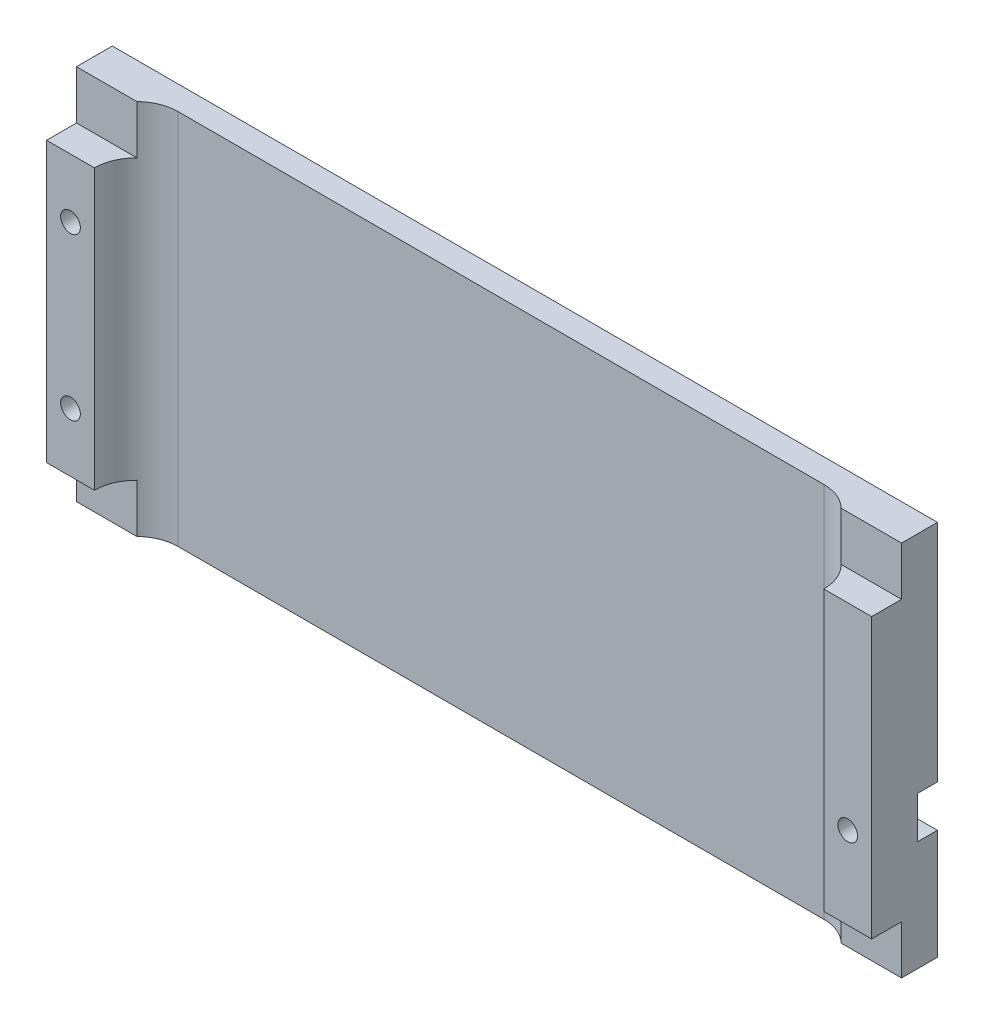
ISO-10303-21;
HEADER;
FILE_DESCRIPTION(('STEP AP214'),'2;1');
FILE_NAME('part.step','',(''),(''),'','','');
FILE_SCHEMA(('AUTOMOTIVE_DESIGN { 1 0 10303 214 1 1 1 1 }'));
ENDSEC;
DATA;
#1=APPLICATION_CONTEXT('core data for automotive mechanical design processes');
#2=APPLICATION_PROTOCOL_DEFINITION('international standard','automotive_design',2000,#1);
#3=PRODUCT_CONTEXT('',#1,'mechanical');
#4=PRODUCT('Part','Part','',(#3));
#5=PRODUCT_RELATED_PRODUCT_CATEGORY('part','',(#4));
#6=PRODUCT_DEFINITION_FORMATION('','',#4);
#7=PRODUCT_DEFINITION_CONTEXT('part definition',#1,'design');
#8=PRODUCT_DEFINITION('design','',#6,#7);
#9=PRODUCT_DEFINITION_SHAPE('','',#8);
#10=(LENGTH_UNIT() NAMED_UNIT(*) SI_UNIT(.MILLI.,.METRE.));
#11=(NAMED_UNIT(*) PLANE_ANGLE_UNIT() SI_UNIT($,.RADIAN.));
#12=(NAMED_UNIT(*) SI_UNIT($,.STERADIAN.) SOLID_ANGLE_UNIT());
#13=UNCERTAINTY_MEASURE_WITH_UNIT(LENGTH_MEASURE(1.E-05),#10,'distance_accuracy_value','');
#14=(GEOMETRIC_REPRESENTATION_CONTEXT(3) GLOBAL_UNCERTAINTY_ASSIGNED_CONTEXT((#13)) GLOBAL_UNIT_ASSIGNED_CONTEXT((#10,
#11,#12)) REPRESENTATION_CONTEXT('',''));
#15=CARTESIAN_POINT('',(0.,0.,0.));
#16=DIRECTION('',(0.,0.,1.));
#17=DIRECTION('',(1.,0.,0.));
#18=AXIS2_PLACEMENT_3D('',#15,#16,#17);
#19=CARTESIAN_POINT('',(-65.,13.5,11.));
#20=DIRECTION('',(0.,0.,-1.));
#21=DIRECTION('',(-1.,0.,0.));
#22=AXIS2_PLACEMENT_3D('',#19,#20,#21);
#23=CYLINDRICAL_SURFACE('',#22,1.65);
#24=CARTESIAN_POINT('',(-65.,13.5,11.));
#25=DIRECTION('',(0.,0.,-1.));
#26=DIRECTION('',(-1.,0.,0.));
#27=AXIS2_PLACEMENT_3D('',#24,#25,#26);
#28=CIRCLE('',#27,1.65);
#29=CARTESIAN_POINT('',(-66.65,13.5,11.));
#30=VERTEX_POINT('',#29);
#31=EDGE_CURVE('E317',#30,#30,#28,.T.);
#32=ORIENTED_EDGE('',*,*,#31,.F.);
#33=EDGE_LOOP('',(#32));
#34=FACE_BOUND('',#33,.T.);
#35=CARTESIAN_POINT('',(-65.,13.5,3.3));
#36=DIRECTION('',(0.,0.,-1.));
#37=DIRECTION('',(-1.,0.,0.));
#38=AXIS2_PLACEMENT_3D('',#35,#36,#37);
#39=CIRCLE('',#38,1.65);
#40=CARTESIAN_POINT('',(-66.65,13.5,3.3));
#41=VERTEX_POINT('',#40);
#42=EDGE_CURVE('E310',#41,#41,#39,.F.);
#43=ORIENTED_EDGE('',*,*,#42,.F.);
#44=EDGE_LOOP('',(#43));
#45=FACE_BOUND('',#44,.T.);
#46=ADVANCED_FACE('F32',(#34,#45),#23,.F.);
#47=CARTESIAN_POINT('',(-65.,-13.5,11.));
#48=DIRECTION('',(0.,0.,-1.));
#49=DIRECTION('',(-1.,0.,0.));
#50=AXIS2_PLACEMENT_3D('',#47,#48,#49);
#51=CYLINDRICAL_SURFACE('',#50,1.65);
#52=CARTESIAN_POINT('',(-65.,-13.5,11.));
#53=DIRECTION('',(0.,0.,-1.));
#54=DIRECTION('',(-1.,0.,0.));
#55=AXIS2_PLACEMENT_3D('',#52,#53,#54);
#56=CIRCLE('',#55,1.65);
#57=CARTESIAN_POINT('',(-66.65,-13.5,11.));
#58=VERTEX_POINT('',#57);
#59=EDGE_CURVE('E314',#58,#58,#56,.T.);
#60=ORIENTED_EDGE('',*,*,#59,.F.);
#61=EDGE_LOOP('',(#60));
#62=FACE_BOUND('',#61,.T.);
#63=CARTESIAN_POINT('',(-65.,-13.5,3.3));
#64=DIRECTION('',(0.,0.,-1.));
#65=DIRECTION('',(-1.,0.,0.));
#66=AXIS2_PLACEMENT_3D('',#63,#64,#65);
#67=CIRCLE('',#66,1.65);
#68=CARTESIAN_POINT('',(-66.65,-13.5,3.3));
#69=VERTEX_POINT('',#68);
#70=EDGE_CURVE('E412',#69,#69,#67,.F.);
#71=ORIENTED_EDGE('',*,*,#70,.F.);
#72=EDGE_LOOP('',(#71));
#73=FACE_BOUND('',#72,.T.);
#74=ADVANCED_FACE('F514',(#62,#73),#51,.F.);
#75=CARTESIAN_POINT('',(65.,-9.60000000000002,11.));
#76=DIRECTION('',(0.,0.,-1.));
#77=DIRECTION('',(-1.,0.,0.));
#78=AXIS2_PLACEMENT_3D('',#75,#76,#77);
#79=CYLINDRICAL_SURFACE('',#78,1.65);
#80=CARTESIAN_POINT('',(65.,-9.60000000000002,11.));
#81=DIRECTION('',(0.,0.,-1.));
#82=DIRECTION('',(-1.,0.,0.));
#83=AXIS2_PLACEMENT_3D('',#80,#81,#82);
#84=CIRCLE('',#83,1.65);
#85=CARTESIAN_POINT('',(63.35,-9.60000000000002,11.));
#86=VERTEX_POINT('',#85);
#87=EDGE_CURVE('E313',#86,#86,#84,.T.);
#88=ORIENTED_EDGE('',*,*,#87,.F.);
#89=EDGE_LOOP('',(#88));
#90=FACE_BOUND('',#89,.T.);
#91=CARTESIAN_POINT('',(65.,-9.60000000000002,3.3));
#92=DIRECTION('',(0.,0.,-1.));
#93=DIRECTION('',(-1.,0.,0.));
#94=AXIS2_PLACEMENT_3D('',#91,#92,#93);
#95=CIRCLE('',#94,1.65);
#96=CARTESIAN_POINT('',(63.35,-9.60000000000002,3.3));
#97=VERTEX_POINT('',#96);
#98=EDGE_CURVE('E299',#97,#97,#95,.F.);
#99=ORIENTED_EDGE('',*,*,#98,.F.);
#100=EDGE_LOOP('',(#99));
#101=FACE_BOUND('',#100,.T.);
#102=ADVANCED_FACE('F520',(#90,#101),#79,.F.);
#103=CARTESIAN_POINT('',(0.,0.,6.));
#104=DIRECTION('',(0.,0.,1.));
#105=DIRECTION('',(1.,0.,0.));
#106=AXIS2_PLACEMENT_3D('',#103,#104,#105);
#107=PLANE('',#106);
#108=DIRECTION('',(1.,0.,0.));
#109=VECTOR('',#108,1.);
#110=CARTESIAN_POINT('',(-69.,-31.5,6.));
#111=LINE('',#110,#109);
#112=CARTESIAN_POINT('',(-69.,-31.5,6.));
#113=VERTEX_POINT('',#112);
#114=CARTESIAN_POINT('',(-58.8989794855664,-31.5,6.));
#115=VERTEX_POINT('',#114);
#116=EDGE_CURVE('E53',#113,#115,#111,.T.);
#117=ORIENTED_EDGE('',*,*,#116,.T.);
#118=DIRECTION('',(0.,1.,0.));
#119=VECTOR('',#118,1.);
#120=CARTESIAN_POINT('',(-58.8989794855664,-31.5,6.));
#121=LINE('',#120,#119);
#122=CARTESIAN_POINT('',(-58.8989794855664,-23.35,6.));
#123=VERTEX_POINT('',#122);
#124=EDGE_CURVE('E40',#115,#123,#121,.T.);
#125=ORIENTED_EDGE('',*,*,#124,.T.);
#126=DIRECTION('',(1.,0.,0.));
#127=VECTOR('',#126,1.);
#128=CARTESIAN_POINT('',(-69.,-23.35,6.));
#129=LINE('',#128,#127);
#130=CARTESIAN_POINT('',(-69.,-23.35,6.));
#131=VERTEX_POINT('',#130);
#132=EDGE_CURVE('E46',#131,#123,#129,.T.);
#133=ORIENTED_EDGE('',*,*,#132,.F.);
#134=DIRECTION('',(0.,-1.,0.));
#135=VECTOR('',#134,1.);
#136=CARTESIAN_POINT('',(-69.,31.5,6.));
#137=LINE('',#136,#135);
#138=EDGE_CURVE('E362',#131,#113,#137,.T.);
#139=ORIENTED_EDGE('',*,*,#138,.T.);
#140=EDGE_LOOP('',(#117,#125,#133,#139));
#141=FACE_BOUND('',#140,.T.);
#142=ADVANCED_FACE('F447',(#141),#107,.T.);
#143=CARTESIAN_POINT('',(-69.,31.5,6.));
#144=VERTEX_POINT('',#143);
#145=CARTESIAN_POINT('',(-69.,23.35,6.));
#146=VERTEX_POINT('',#145);
#147=EDGE_CURVE('E363',#144,#146,#137,.T.);
#148=ORIENTED_EDGE('',*,*,#147,.T.);
#149=DIRECTION('',(-1.,0.,0.));
#150=VECTOR('',#149,1.);
#151=CARTESIAN_POINT('',(-69.,23.35,6.));
#152=LINE('',#151,#150);
#153=CARTESIAN_POINT('',(-58.8989794855664,23.35,6.));
#154=VERTEX_POINT('',#153);
#155=EDGE_CURVE('E326',#154,#146,#152,.T.);
#156=ORIENTED_EDGE('',*,*,#155,.F.);
#157=DIRECTION('',(0.,1.,0.));
#158=VECTOR('',#157,1.);
#159=CARTESIAN_POINT('',(-58.8989794855664,23.35,6.));
#160=LINE('',#159,#158);
#161=CARTESIAN_POINT('',(-58.8989794855664,31.5,6.));
#162=VERTEX_POINT('',#161);
#163=EDGE_CURVE('E439',#154,#162,#160,.T.);
#164=ORIENTED_EDGE('',*,*,#163,.T.);
#165=DIRECTION('',(-1.,0.,0.));
#166=VECTOR('',#165,1.);
#167=CARTESIAN_POINT('',(-69.,31.5,6.));
#168=LINE('',#167,#166);
#169=EDGE_CURVE('E367',#162,#144,#168,.T.);
#170=ORIENTED_EDGE('',*,*,#169,.T.);
#171=EDGE_LOOP('',(#148,#156,#164,#170));
#172=FACE_BOUND('',#171,.T.);
#173=ADVANCED_FACE('F499',(#172),#107,.T.);
#174=CARTESIAN_POINT('',(0.,0.,6.));
#175=DIRECTION('',(0.,0.,-1.));
#176=DIRECTION('',(-1.,0.,0.));
#177=AXIS2_PLACEMENT_3D('',#174,#175,#176);
#178=PLANE('',#177);
#179=DIRECTION('',(1.,0.,0.));
#180=VECTOR('',#179,1.);
#181=CARTESIAN_POINT('',(61.,-23.35,6.));
#182=LINE('',#181,#180);
#183=CARTESIAN_POINT('',(58.8989794855664,-23.35,6.));
#184=VERTEX_POINT('',#183);
#185=CARTESIAN_POINT('',(69.,-23.35,6.));
#186=VERTEX_POINT('',#185);
#187=EDGE_CURVE('E341',#184,#186,#182,.T.);
#188=ORIENTED_EDGE('',*,*,#187,.F.);
#189=DIRECTION('',(0.,-1.,0.));
#190=VECTOR('',#189,1.);
#191=CARTESIAN_POINT('',(58.8989794855664,-23.35,6.));
#192=LINE('',#191,#190);
#193=CARTESIAN_POINT('',(58.8989794855664,-31.5,6.));
#194=VERTEX_POINT('',#193);
#195=EDGE_CURVE('E423',#184,#194,#192,.T.);
#196=ORIENTED_EDGE('',*,*,#195,.T.);
#197=DIRECTION('',(1.,0.,0.));
#198=VECTOR('',#197,1.);
#199=CARTESIAN_POINT('',(69.,-31.5,6.));
#200=LINE('',#199,#198);
#201=CARTESIAN_POINT('',(69.,-31.5,6.));
#202=VERTEX_POINT('',#201);
#203=EDGE_CURVE('E375',#194,#202,#200,.T.);
#204=ORIENTED_EDGE('',*,*,#203,.T.);
#205=DIRECTION('',(0.,1.,0.));
#206=VECTOR('',#205,1.);
#207=CARTESIAN_POINT('',(69.,31.5,6.));
#208=LINE('',#207,#206);
#209=EDGE_CURVE('E371',#202,#186,#208,.T.);
#210=ORIENTED_EDGE('',*,*,#209,.T.);
#211=EDGE_LOOP('',(#188,#196,#204,#210));
#212=FACE_BOUND('',#211,.T.);
#213=ADVANCED_FACE('F775',(#212),#178,.F.);
#214=DIRECTION('',(-1.,0.,0.));
#215=VECTOR('',#214,1.);
#216=CARTESIAN_POINT('',(61.,23.35,6.));
#217=LINE('',#216,#215);
#218=CARTESIAN_POINT('',(69.,23.35,6.));
#219=VERTEX_POINT('',#218);
#220=CARTESIAN_POINT('',(58.8989794855664,23.35,6.));
#221=VERTEX_POINT('',#220);
#222=EDGE_CURVE('E346',#219,#221,#217,.T.);
#223=ORIENTED_EDGE('',*,*,#222,.F.);
#224=CARTESIAN_POINT('',(69.,31.5,6.));
#225=VERTEX_POINT('',#224);
#226=EDGE_CURVE('E370',#219,#225,#208,.T.);
#227=ORIENTED_EDGE('',*,*,#226,.T.);
#228=DIRECTION('',(-1.,0.,0.));
#229=VECTOR('',#228,1.);
#230=CARTESIAN_POINT('',(69.,31.5,6.));
#231=LINE('',#230,#229);
#232=CARTESIAN_POINT('',(58.8989794855664,31.5,6.));
#233=VERTEX_POINT('',#232);
#234=EDGE_CURVE('E373',#225,#233,#231,.T.);
#235=ORIENTED_EDGE('',*,*,#234,.T.);
#236=DIRECTION('',(0.,-1.,0.));
#237=VECTOR('',#236,1.);
#238=CARTESIAN_POINT('',(58.8989794855664,31.5,6.));
#239=LINE('',#238,#237);
#240=EDGE_CURVE('E431',#233,#221,#239,.T.);
#241=ORIENTED_EDGE('',*,*,#240,.T.);
#242=EDGE_LOOP('',(#223,#227,#235,#241));
#243=FACE_BOUND('',#242,.T.);
#244=ADVANCED_FACE('F485',(#243),#178,.F.);
#245=CARTESIAN_POINT('',(0.,0.,4.));
#246=DIRECTION('',(0.,0.,1.));
#247=DIRECTION('',(1.,0.,0.));
#248=AXIS2_PLACEMENT_3D('',#245,#246,#247);
#249=PLANE('',#248);
#250=DIRECTION('',(1.,0.,0.));
#251=VECTOR('',#250,1.);
#252=CARTESIAN_POINT('',(69.,-31.5,4.));
#253=LINE('',#252,#251);
#254=CARTESIAN_POINT('',(-54.,-31.5,4.));
#255=VERTEX_POINT('',#254);
#256=CARTESIAN_POINT('',(54.,-31.5,4.));
#257=VERTEX_POINT('',#256);
#258=EDGE_CURVE('E379',#255,#257,#253,.T.);
#259=ORIENTED_EDGE('',*,*,#258,.T.);
#260=DIRECTION('',(0.,-1.,0.));
#261=VECTOR('',#260,1.);
#262=CARTESIAN_POINT('',(54.,0.,4.));
#263=LINE('',#262,#261);
#264=CARTESIAN_POINT('',(54.,31.5,4.));
#265=VERTEX_POINT('',#264);
#266=EDGE_CURVE('E418',#257,#265,#263,.F.);
#267=ORIENTED_EDGE('',*,*,#266,.T.);
#268=DIRECTION('',(-1.,0.,0.));
#269=VECTOR('',#268,1.);
#270=CARTESIAN_POINT('',(69.,31.5,4.));
#271=LINE('',#270,#269);
#272=CARTESIAN_POINT('',(-54.,31.5,4.));
#273=VERTEX_POINT('',#272);
#274=EDGE_CURVE('E382',#265,#273,#271,.T.);
#275=ORIENTED_EDGE('',*,*,#274,.T.);
#276=DIRECTION('',(0.,1.,0.));
#277=VECTOR('',#276,1.);
#278=CARTESIAN_POINT('',(-54.,0.,4.));
#279=LINE('',#278,#277);
#280=EDGE_CURVE('E409',#273,#255,#279,.F.);
#281=ORIENTED_EDGE('',*,*,#280,.T.);
#282=EDGE_LOOP('',(#259,#267,#275,#281));
#283=FACE_BOUND('',#282,.T.);
#284=ADVANCED_FACE('F471',(#283),#249,.T.);
#285=CARTESIAN_POINT('',(-69.,-31.5,4.));
#286=DIRECTION('',(1.,0.,0.));
#287=DIRECTION('',(0.,0.,-1.));
#288=AXIS2_PLACEMENT_3D('',#285,#286,#287);
#289=PLANE('',#288);
#290=DIRECTION('',(0.,-1.,0.));
#291=VECTOR('',#290,1.);
#292=CARTESIAN_POINT('',(-69.,-31.5,0.));
#293=LINE('',#292,#291);
#294=CARTESIAN_POINT('',(-69.,31.5,0.));
#295=VERTEX_POINT('',#294);
#296=CARTESIAN_POINT('',(-69.,17.,0.));
#297=VERTEX_POINT('',#296);
#298=EDGE_CURVE('E387',#295,#297,#293,.T.);
#299=ORIENTED_EDGE('',*,*,#298,.T.);
#300=DIRECTION('',(0.,0.,1.));
#301=VECTOR('',#300,1.);
#302=CARTESIAN_POINT('',(-69.,17.,4.));
#303=LINE('',#302,#301);
#304=CARTESIAN_POINT('',(-69.,17.,3.3));
#305=VERTEX_POINT('',#304);
#306=EDGE_CURVE('E309',#297,#305,#303,.T.);
#307=ORIENTED_EDGE('',*,*,#306,.T.);
#308=DIRECTION('',(0.,1.,0.));
#309=VECTOR('',#308,1.);
#310=CARTESIAN_POINT('',(-69.,-31.5,3.3));
#311=LINE('',#310,#309);
#312=CARTESIAN_POINT('',(-69.,9.99999999999999,3.3));
#313=VERTEX_POINT('',#312);
#314=EDGE_CURVE('E307',#313,#305,#311,.T.);
#315=ORIENTED_EDGE('',*,*,#314,.F.);
#316=DIRECTION('',(0.,0.,-1.));
#317=VECTOR('',#316,1.);
#318=CARTESIAN_POINT('',(-69.,9.99999999999999,3.3));
#319=LINE('',#318,#317);
#320=CARTESIAN_POINT('',(-69.,9.99999999999999,0.));
#321=VERTEX_POINT('',#320);
#322=EDGE_CURVE('E226',#313,#321,#319,.T.);
#323=ORIENTED_EDGE('',*,*,#322,.T.);
#324=CARTESIAN_POINT('',(-69.,-10.,0.));
#325=VERTEX_POINT('',#324);
#326=EDGE_CURVE('E391',#321,#325,#293,.T.);
#327=ORIENTED_EDGE('',*,*,#326,.T.);
#328=DIRECTION('',(0.,0.,-1.));
#329=VECTOR('',#328,1.);
#330=CARTESIAN_POINT('',(-69.,-10.,3.3));
#331=LINE('',#330,#329);
#332=CARTESIAN_POINT('',(-69.,-10.,3.3));
#333=VERTEX_POINT('',#332);
#334=EDGE_CURVE('E300',#333,#325,#331,.T.);
#335=ORIENTED_EDGE('',*,*,#334,.F.);
#336=DIRECTION('',(0.,1.,0.));
#337=VECTOR('',#336,1.);
#338=CARTESIAN_POINT('',(-69.,-17.,3.3));
#339=LINE('',#338,#337);
#340=CARTESIAN_POINT('',(-69.,-17.,3.3));
#341=VERTEX_POINT('',#340);
#342=EDGE_CURVE('E286',#341,#333,#339,.T.);
#343=ORIENTED_EDGE('',*,*,#342,.F.);
#344=DIRECTION('',(0.,0.,-1.));
#345=VECTOR('',#344,1.);
#346=CARTESIAN_POINT('',(-69.,-17.,3.3));
#347=LINE('',#346,#345);
#348=CARTESIAN_POINT('',(-69.,-17.,0.));
#349=VERTEX_POINT('',#348);
#350=EDGE_CURVE('E302',#341,#349,#347,.T.);
#351=ORIENTED_EDGE('',*,*,#350,.T.);
#352=CARTESIAN_POINT('',(-69.,-31.5,0.));
#353=VERTEX_POINT('',#352);
#354=EDGE_CURVE('E378',#349,#353,#293,.T.);
#355=ORIENTED_EDGE('',*,*,#354,.T.);
#356=DIRECTION('',(0.,0.,-1.));
#357=VECTOR('',#356,1.);
#358=CARTESIAN_POINT('',(-69.,-31.5,4.));
#359=LINE('',#358,#357);
#360=EDGE_CURVE('E406',#113,#353,#359,.T.);
#361=ORIENTED_EDGE('',*,*,#360,.F.);
#362=ORIENTED_EDGE('',*,*,#138,.F.);
#363=DIRECTION('',(0.,0.,-1.));
#364=VECTOR('',#363,1.);
#365=CARTESIAN_POINT('',(-69.,-23.35,11.));
#366=LINE('',#365,#364);
#367=CARTESIAN_POINT('',(-69.,-23.35,11.));
#368=VERTEX_POINT('',#367);
#369=EDGE_CURVE('E339',#368,#131,#366,.T.);
#370=ORIENTED_EDGE('',*,*,#369,.F.);
#371=DIRECTION('',(0.,-1.,0.));
#372=VECTOR('',#371,1.);
#373=CARTESIAN_POINT('',(-69.,23.35,11.));
#374=LINE('',#373,#372);
#375=CARTESIAN_POINT('',(-69.,23.35,11.));
#376=VERTEX_POINT('',#375);
#377=EDGE_CURVE('E322',#376,#368,#374,.T.);
#378=ORIENTED_EDGE('',*,*,#377,.F.);
#379=DIRECTION('',(0.,0.,-1.));
#380=VECTOR('',#379,1.);
#381=CARTESIAN_POINT('',(-69.,23.35,11.));
#382=LINE('',#381,#380);
#383=EDGE_CURVE('E334',#376,#146,#382,.T.);
#384=ORIENTED_EDGE('',*,*,#383,.T.);
#385=ORIENTED_EDGE('',*,*,#147,.F.);
#386=DIRECTION('',(0.,0.,-1.));
#387=VECTOR('',#386,1.);
#388=CARTESIAN_POINT('',(-69.,31.5,4.));
#389=LINE('',#388,#387);
#390=EDGE_CURVE('E386',#144,#295,#389,.T.);
#391=ORIENTED_EDGE('',*,*,#390,.T.);
#392=EDGE_LOOP('',(#299,#307,#315,#323,#327,#335,#343,#351,#355,#361,#362,#370,#378,#384,#385,#391));
#393=FACE_BOUND('',#392,.T.);
#394=ADVANCED_FACE('F460',(#393),#289,.F.);
#395=CARTESIAN_POINT('',(69.,-31.5,4.));
#396=DIRECTION('',(0.,1.,0.));
#397=DIRECTION('',(-1.,0.,0.));
#398=AXIS2_PLACEMENT_3D('',#395,#396,#397);
#399=PLANE('',#398);
#400=DIRECTION('',(1.,0.,0.));
#401=VECTOR('',#400,1.);
#402=CARTESIAN_POINT('',(69.,-31.5,0.));
#403=LINE('',#402,#401);
#404=CARTESIAN_POINT('',(69.,-31.5,0.));
#405=VERTEX_POINT('',#404);
#406=EDGE_CURVE('E390',#353,#405,#403,.T.);
#407=ORIENTED_EDGE('',*,*,#406,.T.);
#408=DIRECTION('',(0.,0.,-1.));
#409=VECTOR('',#408,1.);
#410=CARTESIAN_POINT('',(69.,-31.5,4.));
#411=LINE('',#410,#409);
#412=EDGE_CURVE('E403',#202,#405,#411,.T.);
#413=ORIENTED_EDGE('',*,*,#412,.F.);
#414=ORIENTED_EDGE('',*,*,#203,.F.);
#415=CARTESIAN_POINT('',(54.,-31.5,11.));
#416=DIRECTION('',(0.,1.,0.));
#417=DIRECTION('',(-1.,0.,0.));
#418=AXIS2_PLACEMENT_3D('',#415,#416,#417);
#419=CIRCLE('',#418,7.);
#420=EDGE_CURVE('E426',#194,#257,#419,.T.);
#421=ORIENTED_EDGE('',*,*,#420,.T.);
#422=ORIENTED_EDGE('',*,*,#258,.F.);
#423=CARTESIAN_POINT('',(-54.,-31.5,11.));
#424=DIRECTION('',(0.,1.,0.));
#425=DIRECTION('',(-1.,0.,0.));
#426=AXIS2_PLACEMENT_3D('',#423,#424,#425);
#427=CIRCLE('',#426,7.);
#428=EDGE_CURVE('E444',#255,#115,#427,.T.);
#429=ORIENTED_EDGE('',*,*,#428,.T.);
#430=ORIENTED_EDGE('',*,*,#116,.F.);
#431=ORIENTED_EDGE('',*,*,#360,.T.);
#432=EDGE_LOOP('',(#407,#413,#414,#421,#422,#429,#430,#431));
#433=FACE_BOUND('',#432,.T.);
#434=ADVANCED_FACE('F465',(#433),#399,.F.);
#435=CARTESIAN_POINT('',(69.,-31.5,4.));
#436=DIRECTION('',(-1.,0.,0.));
#437=DIRECTION('',(0.,0.,1.));
#438=AXIS2_PLACEMENT_3D('',#435,#436,#437);
#439=PLANE('',#438);
#440=DIRECTION('',(0.,1.,0.));
#441=VECTOR('',#440,1.);
#442=CARTESIAN_POINT('',(69.,-31.5,0.));
#443=LINE('',#442,#441);
#444=CARTESIAN_POINT('',(69.,-13.1,0.));
#445=VERTEX_POINT('',#444);
#446=EDGE_CURVE('E394',#405,#445,#443,.T.);
#447=ORIENTED_EDGE('',*,*,#446,.T.);
#448=DIRECTION('',(0.,0.,-1.));
#449=VECTOR('',#448,1.);
#450=CARTESIAN_POINT('',(69.,-13.1,3.3));
#451=LINE('',#450,#449);
#452=CARTESIAN_POINT('',(69.,-13.1,3.3));
#453=VERTEX_POINT('',#452);
#454=EDGE_CURVE('E272',#453,#445,#451,.T.);
#455=ORIENTED_EDGE('',*,*,#454,.F.);
#456=DIRECTION('',(0.,-1.,0.));
#457=VECTOR('',#456,1.);
#458=CARTESIAN_POINT('',(69.,-6.10000000000001,3.3));
#459=LINE('',#458,#457);
#460=CARTESIAN_POINT('',(69.,-6.10000000000001,3.3));
#461=VERTEX_POINT('',#460);
#462=EDGE_CURVE('E259',#461,#453,#459,.T.);
#463=ORIENTED_EDGE('',*,*,#462,.F.);
#464=DIRECTION('',(0.,0.,-1.));
#465=VECTOR('',#464,1.);
#466=CARTESIAN_POINT('',(69.,-6.10000000000001,3.3));
#467=LINE('',#466,#465);
#468=CARTESIAN_POINT('',(69.,-6.10000000000001,0.));
#469=VERTEX_POINT('',#468);
#470=EDGE_CURVE('E274',#461,#469,#467,.T.);
#471=ORIENTED_EDGE('',*,*,#470,.T.);
#472=CARTESIAN_POINT('',(69.,31.5,0.));
#473=VERTEX_POINT('',#472);
#474=EDGE_CURVE('E393',#469,#473,#443,.T.);
#475=ORIENTED_EDGE('',*,*,#474,.T.);
#476=DIRECTION('',(0.,0.,-1.));
#477=VECTOR('',#476,1.);
#478=CARTESIAN_POINT('',(69.,31.5,4.));
#479=LINE('',#478,#477);
#480=EDGE_CURVE('E400',#225,#473,#479,.T.);
#481=ORIENTED_EDGE('',*,*,#480,.F.);
#482=ORIENTED_EDGE('',*,*,#226,.F.);
#483=DIRECTION('',(0.,0.,-1.));
#484=VECTOR('',#483,1.);
#485=CARTESIAN_POINT('',(69.,23.35,11.));
#486=LINE('',#485,#484);
#487=CARTESIAN_POINT('',(69.,23.35,11.));
#488=VERTEX_POINT('',#487);
#489=EDGE_CURVE('E353',#488,#219,#486,.T.);
#490=ORIENTED_EDGE('',*,*,#489,.F.);
#491=DIRECTION('',(0.,1.,0.));
#492=VECTOR('',#491,1.);
#493=CARTESIAN_POINT('',(69.,23.35,11.));
#494=LINE('',#493,#492);
#495=CARTESIAN_POINT('',(69.,-23.35,11.));
#496=VERTEX_POINT('',#495);
#497=EDGE_CURVE('E348',#496,#488,#494,.T.);
#498=ORIENTED_EDGE('',*,*,#497,.F.);
#499=DIRECTION('',(0.,0.,-1.));
#500=VECTOR('',#499,1.);
#501=CARTESIAN_POINT('',(69.,-23.35,11.));
#502=LINE('',#501,#500);
#503=EDGE_CURVE('E359',#496,#186,#502,.T.);
#504=ORIENTED_EDGE('',*,*,#503,.T.);
#505=ORIENTED_EDGE('',*,*,#209,.F.);
#506=ORIENTED_EDGE('',*,*,#412,.T.);
#507=EDGE_LOOP('',(#447,#455,#463,#471,#475,#481,#482,#490,#498,#504,#505,#506));
#508=FACE_BOUND('',#507,.T.);
#509=ADVANCED_FACE('F674',(#508),#439,.F.);
#510=CARTESIAN_POINT('',(69.,31.5,4.));
#511=DIRECTION('',(0.,-1.,0.));
#512=DIRECTION('',(1.,0.,0.));
#513=AXIS2_PLACEMENT_3D('',#510,#511,#512);
#514=PLANE('',#513);
#515=DIRECTION('',(-1.,0.,0.));
#516=VECTOR('',#515,1.);
#517=CARTESIAN_POINT('',(69.,31.5,0.));
#518=LINE('',#517,#516);
#519=EDGE_CURVE('E383',#473,#295,#518,.T.);
#520=ORIENTED_EDGE('',*,*,#519,.T.);
#521=ORIENTED_EDGE('',*,*,#390,.F.);
#522=ORIENTED_EDGE('',*,*,#169,.F.);
#523=CARTESIAN_POINT('',(-54.,31.5,11.));
#524=DIRECTION('',(0.,-1.,0.));
#525=DIRECTION('',(1.,0.,0.));
#526=AXIS2_PLACEMENT_3D('',#523,#524,#525);
#527=CIRCLE('',#526,7.);
#528=EDGE_CURVE('E442',#162,#273,#527,.T.);
#529=ORIENTED_EDGE('',*,*,#528,.T.);
#530=ORIENTED_EDGE('',*,*,#274,.F.);
#531=CARTESIAN_POINT('',(54.,31.5,11.));
#532=DIRECTION('',(0.,-1.,0.));
#533=DIRECTION('',(1.,0.,0.));
#534=AXIS2_PLACEMENT_3D('',#531,#532,#533);
#535=CIRCLE('',#534,7.);
#536=EDGE_CURVE('E428',#265,#233,#535,.T.);
#537=ORIENTED_EDGE('',*,*,#536,.T.);
#538=ORIENTED_EDGE('',*,*,#234,.F.);
#539=ORIENTED_EDGE('',*,*,#480,.T.);
#540=EDGE_LOOP('',(#520,#521,#522,#529,#530,#537,#538,#539));
#541=FACE_BOUND('',#540,.T.);
#542=ADVANCED_FACE('F476',(#541),#514,.F.);
#543=CARTESIAN_POINT('',(0.,0.,0.));
#544=DIRECTION('',(0.,0.,1.));
#545=DIRECTION('',(1.,0.,0.));
#546=AXIS2_PLACEMENT_3D('',#543,#544,#545);
#547=PLANE('',#546);
#548=CARTESIAN_POINT('',(65.,-9.60000000000002,0.));
#549=DIRECTION('',(0.,0.,-1.));
#550=DIRECTION('',(-1.,0.,0.));
#551=AXIS2_PLACEMENT_3D('',#548,#549,#550);
#552=CIRCLE('',#551,3.5);
#553=CARTESIAN_POINT('',(65.,-13.1,0.));
#554=VERTEX_POINT('',#553);
#555=CARTESIAN_POINT('',(65.,-6.10000000000001,0.));
#556=VERTEX_POINT('',#555);
#557=EDGE_CURVE('E265',#554,#556,#552,.T.);
#558=ORIENTED_EDGE('',*,*,#557,.F.);
#559=DIRECTION('',(-1.,0.,0.));
#560=VECTOR('',#559,1.);
#561=CARTESIAN_POINT('',(69.,-13.1,0.));
#562=LINE('',#561,#560);
#563=EDGE_CURVE('E256',#445,#554,#562,.T.);
#564=ORIENTED_EDGE('',*,*,#563,.F.);
#565=ORIENTED_EDGE('',*,*,#446,.F.);
#566=ORIENTED_EDGE('',*,*,#406,.F.);
#567=ORIENTED_EDGE('',*,*,#354,.F.);
#568=DIRECTION('',(-1.,0.,0.));
#569=VECTOR('',#568,1.);
#570=CARTESIAN_POINT('',(-65.,-17.,0.));
#571=LINE('',#570,#569);
#572=CARTESIAN_POINT('',(-65.,-17.,0.));
#573=VERTEX_POINT('',#572);
#574=EDGE_CURVE('E293',#573,#349,#571,.T.);
#575=ORIENTED_EDGE('',*,*,#574,.F.);
#576=CARTESIAN_POINT('',(-65.,-13.5,0.));
#577=DIRECTION('',(0.,0.,-1.));
#578=DIRECTION('',(-1.,0.,0.));
#579=AXIS2_PLACEMENT_3D('',#576,#577,#578);
#580=CIRCLE('',#579,3.50000000000001);
#581=CARTESIAN_POINT('',(-65.,-10.,0.));
#582=VERTEX_POINT('',#581);
#583=EDGE_CURVE('E250',#582,#573,#580,.T.);
#584=ORIENTED_EDGE('',*,*,#583,.F.);
#585=DIRECTION('',(1.,0.,0.));
#586=VECTOR('',#585,1.);
#587=CARTESIAN_POINT('',(-69.,-10.,0.));
#588=LINE('',#587,#586);
#589=EDGE_CURVE('E283',#325,#582,#588,.T.);
#590=ORIENTED_EDGE('',*,*,#589,.F.);
#591=ORIENTED_EDGE('',*,*,#326,.F.);
#592=DIRECTION('',(-1.,0.,0.));
#593=VECTOR('',#592,1.);
#594=CARTESIAN_POINT('',(-65.,9.99999999999999,0.));
#595=LINE('',#594,#593);
#596=CARTESIAN_POINT('',(-65.,9.99999999999999,0.));
#597=VERTEX_POINT('',#596);
#598=EDGE_CURVE('E241',#597,#321,#595,.T.);
#599=ORIENTED_EDGE('',*,*,#598,.F.);
#600=CARTESIAN_POINT('',(-65.,13.5,0.));
#601=DIRECTION('',(0.,0.,-1.));
#602=DIRECTION('',(-1.,0.,0.));
#603=AXIS2_PLACEMENT_3D('',#600,#601,#602);
#604=CIRCLE('',#603,3.5);
#605=CARTESIAN_POINT('',(-65.,17.,0.));
#606=VERTEX_POINT('',#605);
#607=EDGE_CURVE('E223',#606,#597,#604,.T.);
#608=ORIENTED_EDGE('',*,*,#607,.F.);
#609=DIRECTION('',(1.,0.,0.));
#610=VECTOR('',#609,1.);
#611=CARTESIAN_POINT('',(-69.1487009629537,17.,0.));
#612=LINE('',#611,#610);
#613=EDGE_CURVE('E239',#297,#606,#612,.T.);
#614=ORIENTED_EDGE('',*,*,#613,.F.);
#615=ORIENTED_EDGE('',*,*,#298,.F.);
#616=ORIENTED_EDGE('',*,*,#519,.F.);
#617=ORIENTED_EDGE('',*,*,#474,.F.);
#618=DIRECTION('',(1.,0.,0.));
#619=VECTOR('',#618,1.);
#620=CARTESIAN_POINT('',(65.,-6.10000000000001,0.));
#621=LINE('',#620,#619);
#622=EDGE_CURVE('E267',#556,#469,#621,.T.);
#623=ORIENTED_EDGE('',*,*,#622,.F.);
#624=EDGE_LOOP('',(#558,#564,#565,#566,#567,#575,#584,#590,#591,#599,#608,#614,#615,#616,#617,#623));
#625=FACE_BOUND('',#624,.T.);
#626=ADVANCED_FACE('F494',(#625),#547,.F.);
#627=CARTESIAN_POINT('',(61.,-23.35,11.));
#628=DIRECTION('',(0.,1.,0.));
#629=DIRECTION('',(0.,0.,1.));
#630=AXIS2_PLACEMENT_3D('',#627,#628,#629);
#631=PLANE('',#630);
#632=ORIENTED_EDGE('',*,*,#187,.T.);
#633=ORIENTED_EDGE('',*,*,#503,.F.);
#634=DIRECTION('',(1.,0.,0.));
#635=VECTOR('',#634,1.);
#636=CARTESIAN_POINT('',(61.,-23.35,11.));
#637=LINE('',#636,#635);
#638=CARTESIAN_POINT('',(61.,-23.35,11.));
#639=VERTEX_POINT('',#638);
#640=EDGE_CURVE('E345',#639,#496,#637,.T.);
#641=ORIENTED_EDGE('',*,*,#640,.F.);
#642=CARTESIAN_POINT('',(54.,-23.35,11.));
#643=DIRECTION('',(0.,1.,0.));
#644=DIRECTION('',(0.,0.,1.));
#645=AXIS2_PLACEMENT_3D('',#642,#643,#644);
#646=CIRCLE('',#645,7.);
#647=EDGE_CURVE('E420',#639,#184,#646,.T.);
#648=ORIENTED_EDGE('',*,*,#647,.T.);
#649=EDGE_LOOP('',(#632,#633,#641,#648));
#650=FACE_BOUND('',#649,.T.);
#651=ADVANCED_FACE('F665',(#650),#631,.F.);
#652=CARTESIAN_POINT('',(61.,23.35,11.));
#653=DIRECTION('',(0.,-1.,0.));
#654=DIRECTION('',(0.,0.,-1.));
#655=AXIS2_PLACEMENT_3D('',#652,#653,#654);
#656=PLANE('',#655);
#657=ORIENTED_EDGE('',*,*,#222,.T.);
#658=CARTESIAN_POINT('',(54.,23.35,11.));
#659=DIRECTION('',(0.,-1.,0.));
#660=DIRECTION('',(0.,0.,-1.));
#661=AXIS2_PLACEMENT_3D('',#658,#659,#660);
#662=CIRCLE('',#661,7.);
#663=CARTESIAN_POINT('',(61.,23.35,11.));
#664=VERTEX_POINT('',#663);
#665=EDGE_CURVE('E434',#221,#664,#662,.T.);
#666=ORIENTED_EDGE('',*,*,#665,.T.);
#667=DIRECTION('',(-1.,0.,0.));
#668=VECTOR('',#667,1.);
#669=CARTESIAN_POINT('',(61.,23.35,11.));
#670=LINE('',#669,#668);
#671=EDGE_CURVE('E350',#488,#664,#670,.T.);
#672=ORIENTED_EDGE('',*,*,#671,.F.);
#673=ORIENTED_EDGE('',*,*,#489,.T.);
#674=EDGE_LOOP('',(#657,#666,#672,#673));
#675=FACE_BOUND('',#674,.T.);
#676=ADVANCED_FACE('F730',(#675),#656,.F.);
#677=CARTESIAN_POINT('',(0.,0.,11.));
#678=DIRECTION('',(0.,0.,1.));
#679=DIRECTION('',(1.,0.,0.));
#680=AXIS2_PLACEMENT_3D('',#677,#678,#679);
#681=PLANE('',#680);
#682=ORIENTED_EDGE('',*,*,#87,.T.);
#683=EDGE_LOOP('',(#682));
#684=FACE_BOUND('',#683,.T.);
#685=DIRECTION('',(0.,-1.,0.));
#686=VECTOR('',#685,1.);
#687=CARTESIAN_POINT('',(61.,23.35,11.));
#688=LINE('',#687,#686);
#689=EDGE_CURVE('E342',#664,#639,#688,.T.);
#690=ORIENTED_EDGE('',*,*,#689,.T.);
#691=ORIENTED_EDGE('',*,*,#640,.T.);
#692=ORIENTED_EDGE('',*,*,#497,.T.);
#693=ORIENTED_EDGE('',*,*,#671,.T.);
#694=EDGE_LOOP('',(#690,#691,#692,#693));
#695=FACE_BOUND('',#694,.T.);
#696=ADVANCED_FACE('F511',(#684,#695),#681,.T.);
#697=CARTESIAN_POINT('',(-69.,-23.35,11.));
#698=DIRECTION('',(0.,1.,0.));
#699=DIRECTION('',(0.,0.,1.));
#700=AXIS2_PLACEMENT_3D('',#697,#698,#699);
#701=PLANE('',#700);
#702=ORIENTED_EDGE('',*,*,#132,.T.);
#703=CARTESIAN_POINT('',(-54.,-23.35,11.));
#704=DIRECTION('',(0.,1.,0.));
#705=DIRECTION('',(0.,0.,1.));
#706=AXIS2_PLACEMENT_3D('',#703,#704,#705);
#707=CIRCLE('',#706,7.);
#708=CARTESIAN_POINT('',(-61.,-23.35,11.));
#709=VERTEX_POINT('',#708);
#710=EDGE_CURVE('E11',#123,#709,#707,.T.);
#711=ORIENTED_EDGE('',*,*,#710,.T.);
#712=DIRECTION('',(1.,0.,0.));
#713=VECTOR('',#712,1.);
#714=CARTESIAN_POINT('',(-69.,-23.35,11.));
#715=LINE('',#714,#713);
#716=EDGE_CURVE('E325',#368,#709,#715,.T.);
#717=ORIENTED_EDGE('',*,*,#716,.F.);
#718=ORIENTED_EDGE('',*,*,#369,.T.);
#719=EDGE_LOOP('',(#702,#711,#717,#718));
#720=FACE_BOUND('',#719,.T.);
#721=ADVANCED_FACE('F452',(#720),#701,.F.);
#722=CARTESIAN_POINT('',(-69.,23.35,11.));
#723=DIRECTION('',(0.,-1.,0.));
#724=DIRECTION('',(0.,0.,-1.));
#725=AXIS2_PLACEMENT_3D('',#722,#723,#724);
#726=PLANE('',#725);
#727=ORIENTED_EDGE('',*,*,#155,.T.);
#728=ORIENTED_EDGE('',*,*,#383,.F.);
#729=DIRECTION('',(-1.,0.,0.));
#730=VECTOR('',#729,1.);
#731=CARTESIAN_POINT('',(-69.,23.35,11.));
#732=LINE('',#731,#730);
#733=CARTESIAN_POINT('',(-61.,23.35,11.));
#734=VERTEX_POINT('',#733);
#735=EDGE_CURVE('E332',#734,#376,#732,.T.);
#736=ORIENTED_EDGE('',*,*,#735,.F.);
#737=CARTESIAN_POINT('',(-54.,23.35,11.));
#738=DIRECTION('',(0.,-1.,0.));
#739=DIRECTION('',(0.,0.,-1.));
#740=AXIS2_PLACEMENT_3D('',#737,#738,#739);
#741=CIRCLE('',#740,7.);
#742=EDGE_CURVE('E436',#734,#154,#741,.T.);
#743=ORIENTED_EDGE('',*,*,#742,.T.);
#744=EDGE_LOOP('',(#727,#728,#736,#743));
#745=FACE_BOUND('',#744,.T.);
#746=ADVANCED_FACE('F501',(#745),#726,.F.);
#747=CARTESIAN_POINT('',(0.,0.,11.));
#748=DIRECTION('',(0.,0.,1.));
#749=DIRECTION('',(1.,0.,0.));
#750=AXIS2_PLACEMENT_3D('',#747,#748,#749);
#751=PLANE('',#750);
#752=ORIENTED_EDGE('',*,*,#59,.T.);
#753=EDGE_LOOP('',(#752));
#754=FACE_BOUND('',#753,.T.);
#755=ORIENTED_EDGE('',*,*,#31,.T.);
#756=EDGE_LOOP('',(#755));
#757=FACE_BOUND('',#756,.T.);
#758=ORIENTED_EDGE('',*,*,#377,.T.);
#759=ORIENTED_EDGE('',*,*,#716,.T.);
#760=DIRECTION('',(0.,1.,0.));
#761=VECTOR('',#760,1.);
#762=CARTESIAN_POINT('',(-61.,23.35,11.));
#763=LINE('',#762,#761);
#764=EDGE_CURVE('E329',#709,#734,#763,.T.);
#765=ORIENTED_EDGE('',*,*,#764,.T.);
#766=ORIENTED_EDGE('',*,*,#735,.T.);
#767=EDGE_LOOP('',(#758,#759,#765,#766));
#768=FACE_BOUND('',#767,.T.);
#769=ADVANCED_FACE('F454',(#754,#757,#768),#751,.T.);
#770=CARTESIAN_POINT('',(65.,-9.60000000000002,3.3));
#771=DIRECTION('',(0.,0.,-1.));
#772=DIRECTION('',(-1.,0.,0.));
#773=AXIS2_PLACEMENT_3D('',#770,#771,#772);
#774=PLANE('',#773);
#775=CARTESIAN_POINT('',(65.,-9.60000000000002,3.3));
#776=DIRECTION('',(0.,0.,-1.));
#777=DIRECTION('',(-1.,0.,0.));
#778=AXIS2_PLACEMENT_3D('',#775,#776,#777);
#779=CIRCLE('',#778,3.5);
#780=CARTESIAN_POINT('',(65.,-13.1,3.3));
#781=VERTEX_POINT('',#780);
#782=CARTESIAN_POINT('',(65.,-6.10000000000001,3.3));
#783=VERTEX_POINT('',#782);
#784=EDGE_CURVE('E252',#781,#783,#779,.T.);
#785=ORIENTED_EDGE('',*,*,#784,.T.);
#786=DIRECTION('',(1.,0.,0.));
#787=VECTOR('',#786,1.);
#788=CARTESIAN_POINT('',(65.,-6.10000000000001,3.3));
#789=LINE('',#788,#787);
#790=EDGE_CURVE('E255',#783,#461,#789,.T.);
#791=ORIENTED_EDGE('',*,*,#790,.T.);
#792=ORIENTED_EDGE('',*,*,#462,.T.);
#793=DIRECTION('',(-1.,0.,0.));
#794=VECTOR('',#793,1.);
#795=CARTESIAN_POINT('',(69.,-13.1,3.3));
#796=LINE('',#795,#794);
#797=EDGE_CURVE('E261',#453,#781,#796,.T.);
#798=ORIENTED_EDGE('',*,*,#797,.T.);
#799=EDGE_LOOP('',(#785,#791,#792,#798));
#800=FACE_BOUND('',#799,.T.);
#801=ORIENTED_EDGE('',*,*,#98,.T.);
#802=EDGE_LOOP('',(#801));
#803=FACE_BOUND('',#802,.T.);
#804=ADVANCED_FACE('F508',(#800,#803),#774,.T.);
#805=CARTESIAN_POINT('',(65.,-9.60000000000002,3.3));
#806=DIRECTION('',(0.,0.,-1.));
#807=DIRECTION('',(-1.,0.,0.));
#808=AXIS2_PLACEMENT_3D('',#805,#806,#807);
#809=CYLINDRICAL_SURFACE('',#808,3.5);
#810=ORIENTED_EDGE('',*,*,#557,.T.);
#811=DIRECTION('',(0.,0.,-1.));
#812=VECTOR('',#811,1.);
#813=CARTESIAN_POINT('',(65.,-6.10000000000001,3.3));
#814=LINE('',#813,#812);
#815=EDGE_CURVE('E264',#783,#556,#814,.T.);
#816=ORIENTED_EDGE('',*,*,#815,.F.);
#817=ORIENTED_EDGE('',*,*,#784,.F.);
#818=DIRECTION('',(0.,0.,-1.));
#819=VECTOR('',#818,1.);
#820=CARTESIAN_POINT('',(65.,-13.1,3.3));
#821=LINE('',#820,#819);
#822=EDGE_CURVE('E246',#781,#554,#821,.T.);
#823=ORIENTED_EDGE('',*,*,#822,.T.);
#824=EDGE_LOOP('',(#810,#816,#817,#823));
#825=FACE_BOUND('',#824,.T.);
#826=ADVANCED_FACE('F538',(#825),#809,.F.);
#827=CARTESIAN_POINT('',(69.,-13.1,3.3));
#828=DIRECTION('',(0.,-1.,0.));
#829=DIRECTION('',(0.,0.,-1.));
#830=AXIS2_PLACEMENT_3D('',#827,#828,#829);
#831=PLANE('',#830);
#832=ORIENTED_EDGE('',*,*,#563,.T.);
#833=ORIENTED_EDGE('',*,*,#822,.F.);
#834=ORIENTED_EDGE('',*,*,#797,.F.);
#835=ORIENTED_EDGE('',*,*,#454,.T.);
#836=EDGE_LOOP('',(#832,#833,#834,#835));
#837=FACE_BOUND('',#836,.T.);
#838=ADVANCED_FACE('F544',(#837),#831,.F.);
#839=CARTESIAN_POINT('',(65.,-6.10000000000001,3.3));
#840=DIRECTION('',(0.,1.,0.));
#841=DIRECTION('',(0.,0.,1.));
#842=AXIS2_PLACEMENT_3D('',#839,#840,#841);
#843=PLANE('',#842);
#844=ORIENTED_EDGE('',*,*,#622,.T.);
#845=ORIENTED_EDGE('',*,*,#470,.F.);
#846=ORIENTED_EDGE('',*,*,#790,.F.);
#847=ORIENTED_EDGE('',*,*,#815,.T.);
#848=EDGE_LOOP('',(#844,#845,#846,#847));
#849=FACE_BOUND('',#848,.T.);
#850=ADVANCED_FACE('F552',(#849),#843,.F.);
#851=CARTESIAN_POINT('',(-65.,-13.5,3.3));
#852=DIRECTION('',(0.,0.,-1.));
#853=DIRECTION('',(-1.,0.,0.));
#854=AXIS2_PLACEMENT_3D('',#851,#852,#853);
#855=PLANE('',#854);
#856=CARTESIAN_POINT('',(-65.,-13.5,3.3));
#857=DIRECTION('',(0.,0.,-1.));
#858=DIRECTION('',(-1.,0.,0.));
#859=AXIS2_PLACEMENT_3D('',#856,#857,#858);
#860=CIRCLE('',#859,3.50000000000001);
#861=CARTESIAN_POINT('',(-65.,-10.,3.3));
#862=VERTEX_POINT('',#861);
#863=CARTESIAN_POINT('',(-65.,-17.,3.3));
#864=VERTEX_POINT('',#863);
#865=EDGE_CURVE('E279',#862,#864,#860,.T.);
#866=ORIENTED_EDGE('',*,*,#865,.T.);
#867=DIRECTION('',(-1.,0.,0.));
#868=VECTOR('',#867,1.);
#869=CARTESIAN_POINT('',(-65.,-17.,3.3));
#870=LINE('',#869,#868);
#871=EDGE_CURVE('E282',#864,#341,#870,.T.);
#872=ORIENTED_EDGE('',*,*,#871,.T.);
#873=ORIENTED_EDGE('',*,*,#342,.T.);
#874=DIRECTION('',(1.,0.,0.));
#875=VECTOR('',#874,1.);
#876=CARTESIAN_POINT('',(-69.,-10.,3.3));
#877=LINE('',#876,#875);
#878=EDGE_CURVE('E288',#333,#862,#877,.T.);
#879=ORIENTED_EDGE('',*,*,#878,.T.);
#880=EDGE_LOOP('',(#866,#872,#873,#879));
#881=FACE_BOUND('',#880,.T.);
#882=ORIENTED_EDGE('',*,*,#70,.T.);
#883=EDGE_LOOP('',(#882));
#884=FACE_BOUND('',#883,.T.);
#885=ADVANCED_FACE('F555',(#881,#884),#855,.T.);
#886=CARTESIAN_POINT('',(-65.,-13.5,3.3));
#887=DIRECTION('',(0.,0.,-1.));
#888=DIRECTION('',(-1.,0.,0.));
#889=AXIS2_PLACEMENT_3D('',#886,#887,#888);
#890=CYLINDRICAL_SURFACE('',#889,3.50000000000001);
#891=ORIENTED_EDGE('',*,*,#583,.T.);
#892=DIRECTION('',(0.,0.,-1.));
#893=VECTOR('',#892,1.);
#894=CARTESIAN_POINT('',(-65.,-17.,3.3));
#895=LINE('',#894,#893);
#896=EDGE_CURVE('E291',#864,#573,#895,.T.);
#897=ORIENTED_EDGE('',*,*,#896,.F.);
#898=ORIENTED_EDGE('',*,*,#865,.F.);
#899=DIRECTION('',(0.,0.,-1.));
#900=VECTOR('',#899,1.);
#901=CARTESIAN_POINT('',(-65.,-10.,3.3));
#902=LINE('',#901,#900);
#903=EDGE_CURVE('E297',#862,#582,#902,.T.);
#904=ORIENTED_EDGE('',*,*,#903,.T.);
#905=EDGE_LOOP('',(#891,#897,#898,#904));
#906=FACE_BOUND('',#905,.T.);
#907=ADVANCED_FACE('F560',(#906),#890,.F.);
#908=CARTESIAN_POINT('',(-69.,-10.,3.3));
#909=DIRECTION('',(0.,1.,0.));
#910=DIRECTION('',(-1.,0.,0.));
#911=AXIS2_PLACEMENT_3D('',#908,#909,#910);
#912=PLANE('',#911);
#913=ORIENTED_EDGE('',*,*,#589,.T.);
#914=ORIENTED_EDGE('',*,*,#903,.F.);
#915=ORIENTED_EDGE('',*,*,#878,.F.);
#916=ORIENTED_EDGE('',*,*,#334,.T.);
#917=EDGE_LOOP('',(#913,#914,#915,#916));
#918=FACE_BOUND('',#917,.T.);
#919=ADVANCED_FACE('F562',(#918),#912,.F.);
#920=CARTESIAN_POINT('',(-65.,-17.,3.3));
#921=DIRECTION('',(0.,-1.,0.));
#922=DIRECTION('',(1.,0.,0.));
#923=AXIS2_PLACEMENT_3D('',#920,#921,#922);
#924=PLANE('',#923);
#925=ORIENTED_EDGE('',*,*,#574,.T.);
#926=ORIENTED_EDGE('',*,*,#350,.F.);
#927=ORIENTED_EDGE('',*,*,#871,.F.);
#928=ORIENTED_EDGE('',*,*,#896,.T.);
#929=EDGE_LOOP('',(#925,#926,#927,#928));
#930=FACE_BOUND('',#929,.T.);
#931=ADVANCED_FACE('F565',(#930),#924,.F.);
#932=CARTESIAN_POINT('',(-69.1487009629537,17.,3.3));
#933=DIRECTION('',(0.,1.,0.));
#934=DIRECTION('',(-1.,0.,0.));
#935=AXIS2_PLACEMENT_3D('',#932,#933,#934);
#936=PLANE('',#935);
#937=ORIENTED_EDGE('',*,*,#613,.T.);
#938=DIRECTION('',(0.,0.,-1.));
#939=VECTOR('',#938,1.);
#940=CARTESIAN_POINT('',(-65.,17.,3.3));
#941=LINE('',#940,#939);
#942=CARTESIAN_POINT('',(-65.,17.,3.3));
#943=VERTEX_POINT('',#942);
#944=EDGE_CURVE('E248',#943,#606,#941,.T.);
#945=ORIENTED_EDGE('',*,*,#944,.F.);
#946=DIRECTION('',(1.,0.,0.));
#947=VECTOR('',#946,1.);
#948=CARTESIAN_POINT('',(-69.1487009629537,17.,3.3));
#949=LINE('',#948,#947);
#950=EDGE_CURVE('E227',#305,#943,#949,.T.);
#951=ORIENTED_EDGE('',*,*,#950,.F.);
#952=ORIENTED_EDGE('',*,*,#306,.F.);
#953=EDGE_LOOP('',(#937,#945,#951,#952));
#954=FACE_BOUND('',#953,.T.);
#955=ADVANCED_FACE('F568',(#954),#936,.F.);
#956=CARTESIAN_POINT('',(-65.,13.5,3.3));
#957=DIRECTION('',(0.,0.,-1.));
#958=DIRECTION('',(-1.,0.,0.));
#959=AXIS2_PLACEMENT_3D('',#956,#957,#958);
#960=PLANE('',#959);
#961=ORIENTED_EDGE('',*,*,#42,.T.);
#962=EDGE_LOOP('',(#961));
#963=FACE_BOUND('',#962,.T.);
#964=ORIENTED_EDGE('',*,*,#314,.T.);
#965=ORIENTED_EDGE('',*,*,#950,.T.);
#966=CARTESIAN_POINT('',(-65.,13.5,3.3));
#967=DIRECTION('',(0.,0.,-1.));
#968=DIRECTION('',(-1.,0.,0.));
#969=AXIS2_PLACEMENT_3D('',#966,#967,#968);
#970=CIRCLE('',#969,3.5);
#971=CARTESIAN_POINT('',(-65.,9.99999999999999,3.3));
#972=VERTEX_POINT('',#971);
#973=EDGE_CURVE('E221',#943,#972,#970,.T.);
#974=ORIENTED_EDGE('',*,*,#973,.T.);
#975=DIRECTION('',(-1.,0.,0.));
#976=VECTOR('',#975,1.);
#977=CARTESIAN_POINT('',(-65.,9.99999999999999,3.3));
#978=LINE('',#977,#976);
#979=EDGE_CURVE('E230',#972,#313,#978,.T.);
#980=ORIENTED_EDGE('',*,*,#979,.T.);
#981=EDGE_LOOP('',(#964,#965,#974,#980));
#982=FACE_BOUND('',#981,.T.);
#983=ADVANCED_FACE('F236',(#963,#982),#960,.T.);
#984=CARTESIAN_POINT('',(-65.,13.5,3.3));
#985=DIRECTION('',(0.,0.,-1.));
#986=DIRECTION('',(-1.,0.,0.));
#987=AXIS2_PLACEMENT_3D('',#984,#985,#986);
#988=CYLINDRICAL_SURFACE('',#987,3.5);
#989=ORIENTED_EDGE('',*,*,#607,.T.);
#990=DIRECTION('',(0.,0.,-1.));
#991=VECTOR('',#990,1.);
#992=CARTESIAN_POINT('',(-65.,9.99999999999999,3.3));
#993=LINE('',#992,#991);
#994=EDGE_CURVE('E216',#972,#597,#993,.T.);
#995=ORIENTED_EDGE('',*,*,#994,.F.);
#996=ORIENTED_EDGE('',*,*,#973,.F.);
#997=ORIENTED_EDGE('',*,*,#944,.T.);
#998=EDGE_LOOP('',(#989,#995,#996,#997));
#999=FACE_BOUND('',#998,.T.);
#1000=ADVANCED_FACE('F218',(#999),#988,.F.);
#1001=CARTESIAN_POINT('',(-65.,9.99999999999999,3.3));
#1002=DIRECTION('',(0.,-1.,0.));
#1003=DIRECTION('',(0.,0.,-1.));
#1004=AXIS2_PLACEMENT_3D('',#1001,#1002,#1003);
#1005=PLANE('',#1004);
#1006=ORIENTED_EDGE('',*,*,#598,.T.);
#1007=ORIENTED_EDGE('',*,*,#322,.F.);
#1008=ORIENTED_EDGE('',*,*,#979,.F.);
#1009=ORIENTED_EDGE('',*,*,#994,.T.);
#1010=EDGE_LOOP('',(#1006,#1007,#1008,#1009));
#1011=FACE_BOUND('',#1010,.T.);
#1012=ADVANCED_FACE('F231',(#1011),#1005,.F.);
#1013=CARTESIAN_POINT('',(54.,31.5,11.));
#1014=DIRECTION('',(0.,-1.,0.));
#1015=DIRECTION('',(0.,0.,-1.));
#1016=AXIS2_PLACEMENT_3D('',#1013,#1014,#1015);
#1017=CYLINDRICAL_SURFACE('',#1016,7.);
#1018=ORIENTED_EDGE('',*,*,#536,.F.);
#1019=ORIENTED_EDGE('',*,*,#266,.F.);
#1020=ORIENTED_EDGE('',*,*,#420,.F.);
#1021=ORIENTED_EDGE('',*,*,#195,.F.);
#1022=ORIENTED_EDGE('',*,*,#647,.F.);
#1023=ORIENTED_EDGE('',*,*,#689,.F.);
#1024=ORIENTED_EDGE('',*,*,#665,.F.);
#1025=ORIENTED_EDGE('',*,*,#240,.F.);
#1026=EDGE_LOOP('',(#1018,#1019,#1020,#1021,#1022,#1023,#1024,#1025));
#1027=FACE_BOUND('',#1026,.T.);
#1028=ADVANCED_FACE('F480',(#1027),#1017,.F.);
#1029=CARTESIAN_POINT('',(-54.,31.5,11.));
#1030=DIRECTION('',(0.,1.,0.));
#1031=DIRECTION('',(0.,0.,1.));
#1032=AXIS2_PLACEMENT_3D('',#1029,#1030,#1031);
#1033=CYLINDRICAL_SURFACE('',#1032,7.);
#1034=ORIENTED_EDGE('',*,*,#428,.F.);
#1035=ORIENTED_EDGE('',*,*,#280,.F.);
#1036=ORIENTED_EDGE('',*,*,#528,.F.);
#1037=ORIENTED_EDGE('',*,*,#163,.F.);
#1038=ORIENTED_EDGE('',*,*,#742,.F.);
#1039=ORIENTED_EDGE('',*,*,#764,.F.);
#1040=ORIENTED_EDGE('',*,*,#710,.F.);
#1041=ORIENTED_EDGE('',*,*,#124,.F.);
#1042=EDGE_LOOP('',(#1034,#1035,#1036,#1037,#1038,#1039,#1040,#1041));
#1043=FACE_BOUND('',#1042,.T.);
#1044=ADVANCED_FACE('F34',(#1043),#1033,.F.);
#1045=CLOSED_SHELL('',(#46,#74,#102,#142,#173,#213,#244,#284,#394,#434,#509,#542,#626,#651,#676,
#696,#721,#746,#769,#804,#826,#838,#850,#885,#907,#919,#931,#955,#983,#1000,#1012,#1028,#1044));
#1046=MANIFOLD_SOLID_BREP('B2',#1045);
#1047=ADVANCED_BREP_SHAPE_REPRESENTATION('',(#18,#1046),#14);
#1048=SHAPE_DEFINITION_REPRESENTATION(#9,#1047);
ENDSEC;
END-ISO-10303-21;
